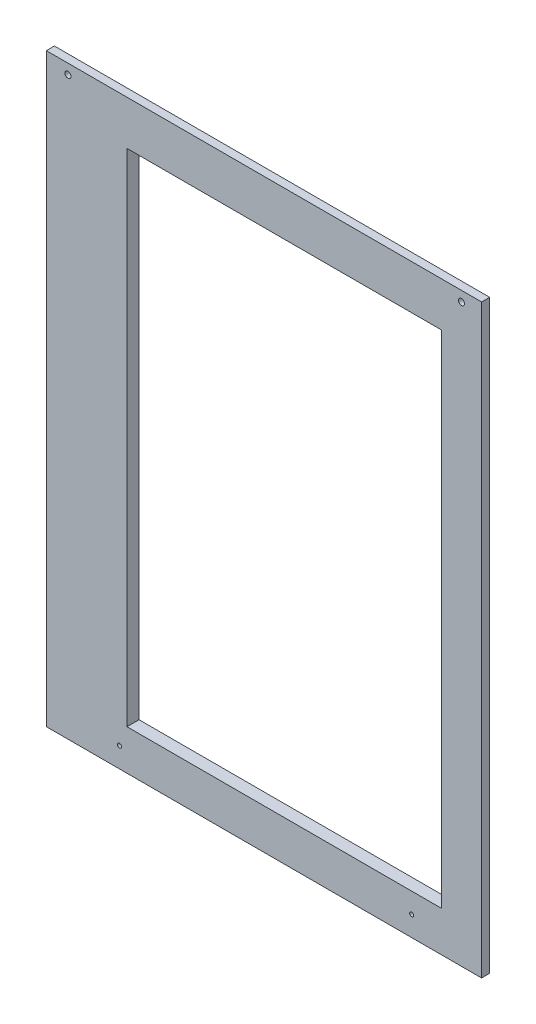
ISO-10303-21;
HEADER;
FILE_DESCRIPTION(('STEP AP214'),'2;1');
FILE_NAME('part.step','',(''),(''),'','','');
FILE_SCHEMA(('AUTOMOTIVE_DESIGN { 1 0 10303 214 1 1 1 1 }'));
ENDSEC;
DATA;
#1=APPLICATION_CONTEXT('core data for automotive mechanical design processes');
#2=APPLICATION_PROTOCOL_DEFINITION('international standard','automotive_design',2000,#1);
#3=PRODUCT_CONTEXT('',#1,'mechanical');
#4=PRODUCT('Part','Part','',(#3));
#5=PRODUCT_RELATED_PRODUCT_CATEGORY('part','',(#4));
#6=PRODUCT_DEFINITION_FORMATION('','',#4);
#7=PRODUCT_DEFINITION_CONTEXT('part definition',#1,'design');
#8=PRODUCT_DEFINITION('design','',#6,#7);
#9=PRODUCT_DEFINITION_SHAPE('','',#8);
#10=(LENGTH_UNIT() NAMED_UNIT(*) SI_UNIT(.MILLI.,.METRE.));
#11=(NAMED_UNIT(*) PLANE_ANGLE_UNIT() SI_UNIT($,.RADIAN.));
#12=(NAMED_UNIT(*) SI_UNIT($,.STERADIAN.) SOLID_ANGLE_UNIT());
#13=UNCERTAINTY_MEASURE_WITH_UNIT(LENGTH_MEASURE(1.E-05),#10,'distance_accuracy_value','');
#14=(GEOMETRIC_REPRESENTATION_CONTEXT(3) GLOBAL_UNCERTAINTY_ASSIGNED_CONTEXT((#13)) GLOBAL_UNIT_ASSIGNED_CONTEXT((#10,
#11,#12)) REPRESENTATION_CONTEXT('',''));
#15=CARTESIAN_POINT('',(0.,0.,0.));
#16=DIRECTION('',(0.,0.,1.));
#17=DIRECTION('',(1.,0.,0.));
#18=AXIS2_PLACEMENT_3D('',#15,#16,#17);
#19=CARTESIAN_POINT('',(18.3499099026795,694.896071586655,4.));
#20=DIRECTION('',(0.,-1.,0.));
#21=DIRECTION('',(1.,0.,0.));
#22=AXIS2_PLACEMENT_3D('',#19,#20,#21);
#23=PLANE('',#22);
#24=DIRECTION('',(-1.,0.,0.));
#25=VECTOR('',#24,1.);
#26=CARTESIAN_POINT('',(18.3499099026795,694.896071586655,4.));
#27=LINE('',#26,#25);
#28=CARTESIAN_POINT('',(217.11384192518,694.896071586655,4.));
#29=VERTEX_POINT('',#28);
#30=CARTESIAN_POINT('',(26.3034685740797,694.896071586655,4.));
#31=VERTEX_POINT('',#30);
#32=EDGE_CURVE('E218',#29,#31,#27,.T.);
#33=ORIENTED_EDGE('',*,*,#32,.F.);
#34=DIRECTION('',(0.,0.,-1.));
#35=VECTOR('',#34,1.);
#36=CARTESIAN_POINT('',(217.11384192518,694.896071586655,4.));
#37=LINE('',#36,#35);
#38=CARTESIAN_POINT('',(217.11384192518,694.896071586655,0.));
#39=VERTEX_POINT('',#38);
#40=EDGE_CURVE('E196',#29,#39,#37,.T.);
#41=ORIENTED_EDGE('',*,*,#40,.T.);
#42=DIRECTION('',(-1.,0.,0.));
#43=VECTOR('',#42,1.);
#44=CARTESIAN_POINT('',(18.3499099026795,694.896071586655,0.));
#45=LINE('',#44,#43);
#46=CARTESIAN_POINT('',(26.3034685740797,694.896071586655,0.));
#47=VERTEX_POINT('',#46);
#48=EDGE_CURVE('E57',#39,#47,#45,.T.);
#49=ORIENTED_EDGE('',*,*,#48,.T.);
#50=DIRECTION('',(0.,0.,-1.));
#51=VECTOR('',#50,1.);
#52=CARTESIAN_POINT('',(26.3034685740797,694.896071586655,4.));
#53=LINE('',#52,#51);
#54=EDGE_CURVE('E374',#47,#31,#53,.F.);
#55=ORIENTED_EDGE('',*,*,#54,.T.);
#56=EDGE_LOOP('',(#33,#41,#49,#55));
#57=FACE_BOUND('',#56,.T.);
#58=ADVANCED_FACE('F34',(#57),#23,.F.);
#59=CARTESIAN_POINT('',(21.83133261908,694.896071586655,4.));
#60=VERTEX_POINT('',#59);
#61=CARTESIAN_POINT('',(18.3499099026795,694.896071586655,4.));
#62=VERTEX_POINT('',#61);
#63=EDGE_CURVE('E220',#60,#62,#27,.T.);
#64=ORIENTED_EDGE('',*,*,#63,.F.);
#65=DIRECTION('',(0.,0.,-1.));
#66=VECTOR('',#65,1.);
#67=CARTESIAN_POINT('',(21.83133261908,694.896071586655,4.));
#68=LINE('',#67,#66);
#69=CARTESIAN_POINT('',(21.83133261908,694.896071586655,0.));
#70=VERTEX_POINT('',#69);
#71=EDGE_CURVE('E369',#60,#70,#68,.T.);
#72=ORIENTED_EDGE('',*,*,#71,.T.);
#73=CARTESIAN_POINT('',(18.3499099026795,694.896071586655,0.));
#74=VERTEX_POINT('',#73);
#75=EDGE_CURVE('E471',#70,#74,#45,.T.);
#76=ORIENTED_EDGE('',*,*,#75,.T.);
#77=DIRECTION('',(0.,0.,-1.));
#78=VECTOR('',#77,1.);
#79=CARTESIAN_POINT('',(18.3499099026795,694.896071586655,4.));
#80=LINE('',#79,#78);
#81=EDGE_CURVE('E217',#62,#74,#80,.T.);
#82=ORIENTED_EDGE('',*,*,#81,.F.);
#83=EDGE_LOOP('',(#64,#72,#76,#82));
#84=FACE_BOUND('',#83,.T.);
#85=ADVANCED_FACE('F447',(#84),#23,.F.);
#86=CARTESIAN_POINT('',(209.34990990268,679.896071586655,8.));
#87=DIRECTION('',(1.,0.,0.));
#88=DIRECTION('',(0.,1.,0.));
#89=AXIS2_PLACEMENT_3D('',#86,#87,#88);
#90=PLANE('',#89);
#91=DIRECTION('',(0.,1.,0.));
#92=VECTOR('',#91,1.);
#93=CARTESIAN_POINT('',(209.34990990268,679.896071586655,2.));
#94=LINE('',#93,#92);
#95=CARTESIAN_POINT('',(209.34990990268,431.342680996655,2.));
#96=VERTEX_POINT('',#95);
#97=CARTESIAN_POINT('',(209.34990990268,679.896071586655,2.));
#98=VERTEX_POINT('',#97);
#99=EDGE_CURVE('E290',#96,#98,#94,.T.);
#100=ORIENTED_EDGE('',*,*,#99,.F.);
#101=DIRECTION('',(0.,0.,-1.));
#102=VECTOR('',#101,1.);
#103=CARTESIAN_POINT('',(209.34990990268,431.342680996655,8.));
#104=LINE('',#103,#102);
#105=CARTESIAN_POINT('',(209.34990990268,431.342680996655,8.));
#106=VERTEX_POINT('',#105);
#107=EDGE_CURVE('E267',#106,#96,#104,.T.);
#108=ORIENTED_EDGE('',*,*,#107,.F.);
#109=DIRECTION('',(0.,-1.,0.));
#110=VECTOR('',#109,1.);
#111=CARTESIAN_POINT('',(209.34990990268,679.896071586655,8.));
#112=LINE('',#111,#110);
#113=CARTESIAN_POINT('',(209.34990990268,679.896071586655,8.));
#114=VERTEX_POINT('',#113);
#115=EDGE_CURVE('E287',#114,#106,#112,.T.);
#116=ORIENTED_EDGE('',*,*,#115,.F.);
#117=DIRECTION('',(0.,0.,-1.));
#118=VECTOR('',#117,1.);
#119=CARTESIAN_POINT('',(209.34990990268,679.896071586655,8.));
#120=LINE('',#119,#118);
#121=EDGE_CURVE('E259',#114,#98,#120,.T.);
#122=ORIENTED_EDGE('',*,*,#121,.T.);
#123=EDGE_LOOP('',(#100,#108,#116,#122));
#124=FACE_BOUND('',#123,.T.);
#125=ADVANCED_FACE('F452',(#124),#90,.F.);
#126=CARTESIAN_POINT('',(209.34990990268,679.896071586655,8.));
#127=DIRECTION('',(0.,1.,0.));
#128=DIRECTION('',(0.,0.,1.));
#129=AXIS2_PLACEMENT_3D('',#126,#127,#128);
#130=PLANE('',#129);
#131=DIRECTION('',(-1.,0.,0.));
#132=VECTOR('',#131,1.);
#133=CARTESIAN_POINT('',(209.34990990268,679.896071586655,2.));
#134=LINE('',#133,#132);
#135=CARTESIAN_POINT('',(53.3499099026795,679.896071586655,2.));
#136=VERTEX_POINT('',#135);
#137=EDGE_CURVE('E292',#98,#136,#134,.T.);
#138=ORIENTED_EDGE('',*,*,#137,.F.);
#139=ORIENTED_EDGE('',*,*,#121,.F.);
#140=DIRECTION('',(1.,0.,0.));
#141=VECTOR('',#140,1.);
#142=CARTESIAN_POINT('',(209.34990990268,679.896071586655,8.));
#143=LINE('',#142,#141);
#144=CARTESIAN_POINT('',(53.3499099026795,679.896071586655,8.));
#145=VERTEX_POINT('',#144);
#146=EDGE_CURVE('E271',#145,#114,#143,.T.);
#147=ORIENTED_EDGE('',*,*,#146,.F.);
#148=DIRECTION('',(0.,0.,-1.));
#149=VECTOR('',#148,1.);
#150=CARTESIAN_POINT('',(53.3499099026795,679.896071586655,8.));
#151=LINE('',#150,#149);
#152=EDGE_CURVE('E274',#145,#136,#151,.T.);
#153=ORIENTED_EDGE('',*,*,#152,.T.);
#154=EDGE_LOOP('',(#138,#139,#147,#153));
#155=FACE_BOUND('',#154,.T.);
#156=ADVANCED_FACE('F497',(#155),#130,.F.);
#157=CARTESIAN_POINT('',(53.3499099026795,679.896071586655,8.));
#158=DIRECTION('',(-1.,0.,0.));
#159=DIRECTION('',(0.,-1.,0.));
#160=AXIS2_PLACEMENT_3D('',#157,#158,#159);
#161=PLANE('',#160);
#162=DIRECTION('',(0.,-1.,0.));
#163=VECTOR('',#162,1.);
#164=CARTESIAN_POINT('',(53.3499099026795,679.896071586655,2.));
#165=LINE('',#164,#163);
#166=CARTESIAN_POINT('',(53.3499099026795,431.342680996655,2.));
#167=VERTEX_POINT('',#166);
#168=EDGE_CURVE('E294',#136,#167,#165,.T.);
#169=ORIENTED_EDGE('',*,*,#168,.F.);
#170=ORIENTED_EDGE('',*,*,#152,.F.);
#171=DIRECTION('',(0.,1.,0.));
#172=VECTOR('',#171,1.);
#173=CARTESIAN_POINT('',(53.3499099026795,679.896071586655,8.));
#174=LINE('',#173,#172);
#175=CARTESIAN_POINT('',(53.3499099026795,431.342680996655,8.));
#176=VERTEX_POINT('',#175);
#177=EDGE_CURVE('E281',#176,#145,#174,.T.);
#178=ORIENTED_EDGE('',*,*,#177,.F.);
#179=DIRECTION('',(0.,0.,-1.));
#180=VECTOR('',#179,1.);
#181=CARTESIAN_POINT('',(53.3499099026795,431.342680996655,8.));
#182=LINE('',#181,#180);
#183=EDGE_CURVE('E270',#176,#167,#182,.T.);
#184=ORIENTED_EDGE('',*,*,#183,.T.);
#185=EDGE_LOOP('',(#169,#170,#178,#184));
#186=FACE_BOUND('',#185,.T.);
#187=ADVANCED_FACE('F491',(#186),#161,.F.);
#188=CARTESIAN_POINT('',(209.34990990268,431.342680996655,8.));
#189=DIRECTION('',(0.,-1.,0.));
#190=DIRECTION('',(0.,0.,-1.));
#191=AXIS2_PLACEMENT_3D('',#188,#189,#190);
#192=PLANE('',#191);
#193=DIRECTION('',(1.,0.,0.));
#194=VECTOR('',#193,1.);
#195=CARTESIAN_POINT('',(209.34990990268,431.342680996655,2.));
#196=LINE('',#195,#194);
#197=EDGE_CURVE('E11',#167,#96,#196,.T.);
#198=ORIENTED_EDGE('',*,*,#197,.F.);
#199=ORIENTED_EDGE('',*,*,#183,.F.);
#200=DIRECTION('',(-1.,0.,0.));
#201=VECTOR('',#200,1.);
#202=CARTESIAN_POINT('',(209.34990990268,431.342680996655,8.));
#203=LINE('',#202,#201);
#204=EDGE_CURVE('E284',#106,#176,#203,.T.);
#205=ORIENTED_EDGE('',*,*,#204,.F.);
#206=ORIENTED_EDGE('',*,*,#107,.T.);
#207=EDGE_LOOP('',(#198,#199,#205,#206));
#208=FACE_BOUND('',#207,.T.);
#209=ADVANCED_FACE('F487',(#208),#192,.F.);
#210=CARTESIAN_POINT('',(18.3499099026795,694.896071586655,4.));
#211=DIRECTION('',(1.,0.,0.));
#212=DIRECTION('',(0.,1.,0.));
#213=AXIS2_PLACEMENT_3D('',#210,#211,#212);
#214=PLANE('',#213);
#215=DIRECTION('',(0.,-1.,0.));
#216=VECTOR('',#215,1.);
#217=CARTESIAN_POINT('',(18.3499099026795,694.896071586655,0.));
#218=LINE('',#217,#216);
#219=CARTESIAN_POINT('',(18.3499099026796,416.342680996655,0.));
#220=VERTEX_POINT('',#219);
#221=EDGE_CURVE('E238',#74,#220,#218,.T.);
#222=ORIENTED_EDGE('',*,*,#221,.T.);
#223=DIRECTION('',(0.,0.,-1.));
#224=VECTOR('',#223,1.);
#225=CARTESIAN_POINT('',(18.3499099026796,416.342680996655,4.));
#226=LINE('',#225,#224);
#227=CARTESIAN_POINT('',(18.3499099026796,416.342680996655,4.));
#228=VERTEX_POINT('',#227);
#229=EDGE_CURVE('E42',#228,#220,#226,.T.);
#230=ORIENTED_EDGE('',*,*,#229,.F.);
#231=DIRECTION('',(0.,-1.,0.));
#232=VECTOR('',#231,1.);
#233=CARTESIAN_POINT('',(18.3499099026795,694.896071586655,4.));
#234=LINE('',#233,#232);
#235=EDGE_CURVE('E231',#62,#228,#234,.T.);
#236=ORIENTED_EDGE('',*,*,#235,.F.);
#237=ORIENTED_EDGE('',*,*,#81,.T.);
#238=EDGE_LOOP('',(#222,#230,#236,#237));
#239=FACE_BOUND('',#238,.T.);
#240=ADVANCED_FACE('F36',(#239),#214,.F.);
#241=CARTESIAN_POINT('',(18.3499099026796,416.342680996655,4.));
#242=DIRECTION('',(0.,1.,0.));
#243=DIRECTION('',(0.,0.,1.));
#244=AXIS2_PLACEMENT_3D('',#241,#242,#243);
#245=PLANE('',#244);
#246=DIRECTION('',(1.,0.,0.));
#247=VECTOR('',#246,1.);
#248=CARTESIAN_POINT('',(18.3499099026796,416.342680996655,0.));
#249=LINE('',#248,#247);
#250=CARTESIAN_POINT('',(224.34990990268,416.342680996655,0.));
#251=VERTEX_POINT('',#250);
#252=EDGE_CURVE('E472',#220,#251,#249,.T.);
#253=ORIENTED_EDGE('',*,*,#252,.T.);
#254=DIRECTION('',(0.,0.,-1.));
#255=VECTOR('',#254,1.);
#256=CARTESIAN_POINT('',(224.34990990268,416.342680996655,4.));
#257=LINE('',#256,#255);
#258=CARTESIAN_POINT('',(224.34990990268,416.342680996655,4.));
#259=VERTEX_POINT('',#258);
#260=EDGE_CURVE('E469',#259,#251,#257,.T.);
#261=ORIENTED_EDGE('',*,*,#260,.F.);
#262=DIRECTION('',(1.,0.,0.));
#263=VECTOR('',#262,1.);
#264=CARTESIAN_POINT('',(18.3499099026796,416.342680996655,4.));
#265=LINE('',#264,#263);
#266=EDGE_CURVE('E230',#228,#259,#265,.T.);
#267=ORIENTED_EDGE('',*,*,#266,.F.);
#268=ORIENTED_EDGE('',*,*,#229,.T.);
#269=EDGE_LOOP('',(#253,#261,#267,#268));
#270=FACE_BOUND('',#269,.T.);
#271=ADVANCED_FACE('F460',(#270),#245,.F.);
#272=CARTESIAN_POINT('',(224.34990990268,694.896071586655,4.));
#273=DIRECTION('',(-1.,0.,0.));
#274=DIRECTION('',(0.,-1.,0.));
#275=AXIS2_PLACEMENT_3D('',#272,#273,#274);
#276=PLANE('',#275);
#277=DIRECTION('',(0.,1.,0.));
#278=VECTOR('',#277,1.);
#279=CARTESIAN_POINT('',(224.34990990268,694.896071586655,0.));
#280=LINE('',#279,#278);
#281=CARTESIAN_POINT('',(224.34990990268,694.896071586655,0.));
#282=VERTEX_POINT('',#281);
#283=EDGE_CURVE('E468',#251,#282,#280,.T.);
#284=ORIENTED_EDGE('',*,*,#283,.T.);
#285=DIRECTION('',(0.,0.,-1.));
#286=VECTOR('',#285,1.);
#287=CARTESIAN_POINT('',(224.34990990268,694.896071586655,4.));
#288=LINE('',#287,#286);
#289=CARTESIAN_POINT('',(224.34990990268,694.896071586655,4.));
#290=VERTEX_POINT('',#289);
#291=EDGE_CURVE('E222',#290,#282,#288,.T.);
#292=ORIENTED_EDGE('',*,*,#291,.F.);
#293=DIRECTION('',(0.,1.,0.));
#294=VECTOR('',#293,1.);
#295=CARTESIAN_POINT('',(224.34990990268,694.896071586655,4.));
#296=LINE('',#295,#294);
#297=EDGE_CURVE('E216',#259,#290,#296,.T.);
#298=ORIENTED_EDGE('',*,*,#297,.F.);
#299=ORIENTED_EDGE('',*,*,#260,.T.);
#300=EDGE_LOOP('',(#284,#292,#298,#299));
#301=FACE_BOUND('',#300,.T.);
#302=ADVANCED_FACE('F456',(#301),#276,.F.);
#303=CARTESIAN_POINT('',(221.585977880179,694.896071586655,0.));
#304=VERTEX_POINT('',#303);
#305=EDGE_CURVE('E210',#282,#304,#45,.T.);
#306=ORIENTED_EDGE('',*,*,#305,.T.);
#307=DIRECTION('',(0.,0.,-1.));
#308=VECTOR('',#307,1.);
#309=CARTESIAN_POINT('',(221.585977880179,694.896071586655,4.));
#310=LINE('',#309,#308);
#311=CARTESIAN_POINT('',(221.585977880179,694.896071586655,4.));
#312=VERTEX_POINT('',#311);
#313=EDGE_CURVE('E49',#304,#312,#310,.F.);
#314=ORIENTED_EDGE('',*,*,#313,.T.);
#315=EDGE_CURVE('E207',#290,#312,#27,.T.);
#316=ORIENTED_EDGE('',*,*,#315,.F.);
#317=ORIENTED_EDGE('',*,*,#291,.T.);
#318=EDGE_LOOP('',(#306,#314,#316,#317));
#319=FACE_BOUND('',#318,.T.);
#320=ADVANCED_FACE('F205',(#319),#23,.F.);
#321=CARTESIAN_POINT('',(0.,0.,0.));
#322=DIRECTION('',(0.,0.,1.));
#323=DIRECTION('',(1.,0.,0.));
#324=AXIS2_PLACEMENT_3D('',#321,#322,#323);
#325=PLANE('',#324);
#326=CARTESIAN_POINT('',(194.662982919324,421.342680996655,0.));
#327=DIRECTION('',(0.,0.,1.));
#328=DIRECTION('',(1.,0.,0.));
#329=AXIS2_PLACEMENT_3D('',#326,#327,#328);
#330=CIRCLE('',#329,0.999999999999998);
#331=CARTESIAN_POINT('',(195.662982919324,421.342680996655,0.));
#332=VERTEX_POINT('',#331);
#333=EDGE_CURVE('E386',#332,#332,#330,.T.);
#334=ORIENTED_EDGE('',*,*,#333,.T.);
#335=EDGE_LOOP('',(#334));
#336=FACE_BOUND('',#335,.T.);
#337=CARTESIAN_POINT('',(49.6629829193239,421.342680996655,0.));
#338=DIRECTION('',(0.,0.,1.));
#339=DIRECTION('',(1.,0.,0.));
#340=AXIS2_PLACEMENT_3D('',#337,#338,#339);
#341=CIRCLE('',#340,0.999999999999998);
#342=CARTESIAN_POINT('',(50.6629829193239,421.342680996655,0.));
#343=VERTEX_POINT('',#342);
#344=EDGE_CURVE('E381',#343,#343,#341,.T.);
#345=ORIENTED_EDGE('',*,*,#344,.T.);
#346=EDGE_LOOP('',(#345));
#347=FACE_BOUND('',#346,.T.);
#348=DIRECTION('',(-1.,0.,0.));
#349=VECTOR('',#348,1.);
#350=CARTESIAN_POINT('',(51.1166559200612,426.342680996655,0.));
#351=LINE('',#350,#349);
#352=CARTESIAN_POINT('',(212.22858955912,426.342680996655,0.));
#353=VERTEX_POINT('',#352);
#354=CARTESIAN_POINT('',(50.4712302462391,426.342680996655,0.));
#355=VERTEX_POINT('',#354);
#356=EDGE_CURVE('E335',#353,#355,#351,.T.);
#357=ORIENTED_EDGE('',*,*,#356,.F.);
#358=CARTESIAN_POINT('',(213.136014933157,427.537075902268,0.));
#359=DIRECTION('',(0.,0.,-1.));
#360=DIRECTION('',(-1.,0.,0.));
#361=AXIS2_PLACEMENT_3D('',#358,#359,#360);
#362=CIRCLE('',#361,1.5);
#363=CARTESIAN_POINT('',(214.34990990268,428.418245013715,0.));
#364=VERTEX_POINT('',#363);
#365=EDGE_CURVE('E314',#364,#353,#362,.T.);
#366=ORIENTED_EDGE('',*,*,#365,.F.);
#367=DIRECTION('',(0.,-1.,0.));
#368=VECTOR('',#367,1.);
#369=CARTESIAN_POINT('',(214.34990990268,682.774751243096,0.));
#370=LINE('',#369,#368);
#371=CARTESIAN_POINT('',(214.34990990268,682.774751243096,0.));
#372=VERTEX_POINT('',#371);
#373=EDGE_CURVE('E317',#372,#364,#370,.T.);
#374=ORIENTED_EDGE('',*,*,#373,.F.);
#375=CARTESIAN_POINT('',(213.2892497309,683.835411414875,0.));
#376=DIRECTION('',(0.,0.,-1.));
#377=DIRECTION('',(-1.,0.,0.));
#378=AXIS2_PLACEMENT_3D('',#375,#376,#377);
#379=CIRCLE('',#378,1.49999999999997);
#380=CARTESIAN_POINT('',(212.22858955912,684.896071586655,0.));
#381=VERTEX_POINT('',#380);
#382=EDGE_CURVE('E320',#381,#372,#379,.T.);
#383=ORIENTED_EDGE('',*,*,#382,.F.);
#384=DIRECTION('',(1.,0.,0.));
#385=VECTOR('',#384,1.);
#386=CARTESIAN_POINT('',(212.22858955912,684.896071586655,0.));
#387=LINE('',#386,#385);
#388=CARTESIAN_POINT('',(50.471230246239,684.896071586655,0.));
#389=VERTEX_POINT('',#388);
#390=EDGE_CURVE('E323',#389,#381,#387,.T.);
#391=ORIENTED_EDGE('',*,*,#390,.F.);
#392=CARTESIAN_POINT('',(49.4105700744593,683.835411414875,0.));
#393=DIRECTION('',(0.,0.,-1.));
#394=DIRECTION('',(-1.,0.,0.));
#395=AXIS2_PLACEMENT_3D('',#392,#393,#394);
#396=CIRCLE('',#395,1.5);
#397=CARTESIAN_POINT('',(48.3499099026795,682.774751243095,0.));
#398=VERTEX_POINT('',#397);
#399=EDGE_CURVE('E326',#398,#389,#396,.T.);
#400=ORIENTED_EDGE('',*,*,#399,.F.);
#401=DIRECTION('',(0.,1.,0.));
#402=VECTOR('',#401,1.);
#403=CARTESIAN_POINT('',(48.3499099026795,682.774751243095,0.));
#404=LINE('',#403,#402);
#405=CARTESIAN_POINT('',(48.3499099026795,428.418245013715,0.));
#406=VERTEX_POINT('',#405);
#407=EDGE_CURVE('E329',#406,#398,#404,.T.);
#408=ORIENTED_EDGE('',*,*,#407,.F.);
#409=CARTESIAN_POINT('',(49.5638048722022,427.537075902268,0.));
#410=DIRECTION('',(0.,0.,-1.));
#411=DIRECTION('',(-1.,0.,0.));
#412=AXIS2_PLACEMENT_3D('',#409,#410,#411);
#413=CIRCLE('',#412,1.49999999999999);
#414=EDGE_CURVE('E332',#355,#406,#413,.T.);
#415=ORIENTED_EDGE('',*,*,#414,.F.);
#416=EDGE_LOOP('',(#357,#366,#374,#383,#391,#400,#408,#415));
#417=FACE_BOUND('',#416,.T.);
#418=ORIENTED_EDGE('',*,*,#48,.F.);
#419=CARTESIAN_POINT('',(219.34990990268,696.896071586655,0.));
#420=DIRECTION('',(0.,0.,-1.));
#421=DIRECTION('',(-1.,0.,0.));
#422=AXIS2_PLACEMENT_3D('',#419,#420,#421);
#423=CIRCLE('',#422,2.99999999999999);
#424=EDGE_CURVE('E200',#304,#39,#423,.T.);
#425=ORIENTED_EDGE('',*,*,#424,.F.);
#426=ORIENTED_EDGE('',*,*,#305,.F.);
#427=ORIENTED_EDGE('',*,*,#283,.F.);
#428=ORIENTED_EDGE('',*,*,#252,.F.);
#429=ORIENTED_EDGE('',*,*,#221,.F.);
#430=ORIENTED_EDGE('',*,*,#75,.F.);
#431=CARTESIAN_POINT('',(24.0674005965799,696.896071586655,0.));
#432=DIRECTION('',(0.,0.,-1.));
#433=DIRECTION('',(-1.,0.,0.));
#434=AXIS2_PLACEMENT_3D('',#431,#432,#433);
#435=CIRCLE('',#434,3.);
#436=EDGE_CURVE('E377',#47,#70,#435,.T.);
#437=ORIENTED_EDGE('',*,*,#436,.F.);
#438=EDGE_LOOP('',(#418,#425,#426,#427,#428,#429,#430,#437));
#439=FACE_BOUND('',#438,.T.);
#440=ADVANCED_FACE('F395',(#336,#347,#417,#439),#325,.F.);
#441=CARTESIAN_POINT('',(0.,0.,4.));
#442=DIRECTION('',(0.,0.,1.));
#443=DIRECTION('',(1.,0.,0.));
#444=AXIS2_PLACEMENT_3D('',#441,#442,#443);
#445=PLANE('',#444);
#446=DIRECTION('',(0.,-1.,0.));
#447=VECTOR('',#446,1.);
#448=CARTESIAN_POINT('',(13.3499099026795,701.896071586655,4.));
#449=LINE('',#448,#447);
#450=CARTESIAN_POINT('',(13.3499099026795,701.896071586655,4.));
#451=VERTEX_POINT('',#450);
#452=CARTESIAN_POINT('',(13.3499099026796,411.342680996655,4.));
#453=VERTEX_POINT('',#452);
#454=EDGE_CURVE('E256',#451,#453,#449,.T.);
#455=ORIENTED_EDGE('',*,*,#454,.F.);
#456=DIRECTION('',(-1.,0.,0.));
#457=VECTOR('',#456,1.);
#458=CARTESIAN_POINT('',(13.3499099026795,701.896071586655,4.));
#459=LINE('',#458,#457);
#460=CARTESIAN_POINT('',(229.34990990268,701.896071586655,4.));
#461=VERTEX_POINT('',#460);
#462=EDGE_CURVE('E249',#461,#451,#459,.T.);
#463=ORIENTED_EDGE('',*,*,#462,.F.);
#464=DIRECTION('',(0.,1.,0.));
#465=VECTOR('',#464,1.);
#466=CARTESIAN_POINT('',(229.34990990268,701.896071586655,4.));
#467=LINE('',#466,#465);
#468=CARTESIAN_POINT('',(229.34990990268,411.342680996655,4.));
#469=VERTEX_POINT('',#468);
#470=EDGE_CURVE('E252',#469,#461,#467,.T.);
#471=ORIENTED_EDGE('',*,*,#470,.F.);
#472=DIRECTION('',(1.,0.,0.));
#473=VECTOR('',#472,1.);
#474=CARTESIAN_POINT('',(13.3499099026796,411.342680996655,4.));
#475=LINE('',#474,#473);
#476=EDGE_CURVE('E254',#453,#469,#475,.T.);
#477=ORIENTED_EDGE('',*,*,#476,.F.);
#478=EDGE_LOOP('',(#455,#463,#471,#477));
#479=FACE_BOUND('',#478,.T.);
#480=ORIENTED_EDGE('',*,*,#315,.T.);
#481=CARTESIAN_POINT('',(219.34990990268,696.896071586655,4.));
#482=DIRECTION('',(0.,0.,-1.));
#483=DIRECTION('',(-1.,0.,0.));
#484=AXIS2_PLACEMENT_3D('',#481,#482,#483);
#485=CIRCLE('',#484,2.99999999999999);
#486=EDGE_CURVE('E194',#312,#29,#485,.T.);
#487=ORIENTED_EDGE('',*,*,#486,.T.);
#488=ORIENTED_EDGE('',*,*,#32,.T.);
#489=CARTESIAN_POINT('',(24.0674005965799,696.896071586655,4.));
#490=DIRECTION('',(0.,0.,-1.));
#491=DIRECTION('',(-1.,0.,0.));
#492=AXIS2_PLACEMENT_3D('',#489,#490,#491);
#493=CIRCLE('',#492,3.);
#494=EDGE_CURVE('E376',#31,#60,#493,.T.);
#495=ORIENTED_EDGE('',*,*,#494,.T.);
#496=ORIENTED_EDGE('',*,*,#63,.T.);
#497=ORIENTED_EDGE('',*,*,#235,.T.);
#498=ORIENTED_EDGE('',*,*,#266,.T.);
#499=ORIENTED_EDGE('',*,*,#297,.T.);
#500=EDGE_LOOP('',(#480,#487,#488,#495,#496,#497,#498,#499));
#501=FACE_BOUND('',#500,.T.);
#502=CARTESIAN_POINT('',(24.0674005965799,696.896071586655,4.));
#503=DIRECTION('',(0.,0.,-1.));
#504=DIRECTION('',(1.,0.,0.));
#505=AXIS2_PLACEMENT_3D('',#502,#503,#504);
#506=CIRCLE('',#505,1.5);
#507=CARTESIAN_POINT('',(25.5674005965799,696.896071586655,4.));
#508=VERTEX_POINT('',#507);
#509=EDGE_CURVE('E366',#508,#508,#506,.T.);
#510=ORIENTED_EDGE('',*,*,#509,.F.);
#511=EDGE_LOOP('',(#510));
#512=FACE_BOUND('',#511,.T.);
#513=CARTESIAN_POINT('',(219.34990990268,696.896071586655,4.));
#514=DIRECTION('',(0.,0.,-1.));
#515=DIRECTION('',(-1.,0.,0.));
#516=AXIS2_PLACEMENT_3D('',#513,#514,#515);
#517=CIRCLE('',#516,1.5);
#518=CARTESIAN_POINT('',(217.84990990268,696.896071586655,4.));
#519=VERTEX_POINT('',#518);
#520=EDGE_CURVE('E360',#519,#519,#517,.T.);
#521=ORIENTED_EDGE('',*,*,#520,.F.);
#522=EDGE_LOOP('',(#521));
#523=FACE_BOUND('',#522,.T.);
#524=ADVANCED_FACE('F212',(#479,#501,#512,#523),#445,.F.);
#525=CARTESIAN_POINT('',(13.3499099026795,701.896071586655,8.));
#526=DIRECTION('',(1.,0.,0.));
#527=DIRECTION('',(0.,1.,0.));
#528=AXIS2_PLACEMENT_3D('',#525,#526,#527);
#529=PLANE('',#528);
#530=ORIENTED_EDGE('',*,*,#454,.T.);
#531=DIRECTION('',(0.,0.,-1.));
#532=VECTOR('',#531,1.);
#533=CARTESIAN_POINT('',(13.3499099026796,411.342680996655,8.));
#534=LINE('',#533,#532);
#535=CARTESIAN_POINT('',(13.3499099026796,411.342680996655,8.));
#536=VERTEX_POINT('',#535);
#537=EDGE_CURVE('E235',#536,#453,#534,.T.);
#538=ORIENTED_EDGE('',*,*,#537,.F.);
#539=DIRECTION('',(0.,-1.,0.));
#540=VECTOR('',#539,1.);
#541=CARTESIAN_POINT('',(13.3499099026795,701.896071586655,8.));
#542=LINE('',#541,#540);
#543=CARTESIAN_POINT('',(13.3499099026795,701.896071586655,8.));
#544=VERTEX_POINT('',#543);
#545=EDGE_CURVE('E251',#544,#536,#542,.T.);
#546=ORIENTED_EDGE('',*,*,#545,.F.);
#547=DIRECTION('',(0.,0.,-1.));
#548=VECTOR('',#547,1.);
#549=CARTESIAN_POINT('',(13.3499099026795,701.896071586655,8.));
#550=LINE('',#549,#548);
#551=EDGE_CURVE('E245',#544,#451,#550,.T.);
#552=ORIENTED_EDGE('',*,*,#551,.T.);
#553=EDGE_LOOP('',(#530,#538,#546,#552));
#554=FACE_BOUND('',#553,.T.);
#555=ADVANCED_FACE('F425',(#554),#529,.F.);
#556=CARTESIAN_POINT('',(13.3499099026796,411.342680996655,8.));
#557=DIRECTION('',(0.,1.,0.));
#558=DIRECTION('',(0.,0.,1.));
#559=AXIS2_PLACEMENT_3D('',#556,#557,#558);
#560=PLANE('',#559);
#561=ORIENTED_EDGE('',*,*,#476,.T.);
#562=DIRECTION('',(0.,0.,-1.));
#563=VECTOR('',#562,1.);
#564=CARTESIAN_POINT('',(229.34990990268,411.342680996655,8.));
#565=LINE('',#564,#563);
#566=CARTESIAN_POINT('',(229.34990990268,411.342680996655,8.));
#567=VERTEX_POINT('',#566);
#568=EDGE_CURVE('E239',#567,#469,#565,.T.);
#569=ORIENTED_EDGE('',*,*,#568,.F.);
#570=DIRECTION('',(1.,0.,0.));
#571=VECTOR('',#570,1.);
#572=CARTESIAN_POINT('',(13.3499099026796,411.342680996655,8.));
#573=LINE('',#572,#571);
#574=EDGE_CURVE('E263',#536,#567,#573,.T.);
#575=ORIENTED_EDGE('',*,*,#574,.F.);
#576=ORIENTED_EDGE('',*,*,#537,.T.);
#577=EDGE_LOOP('',(#561,#569,#575,#576));
#578=FACE_BOUND('',#577,.T.);
#579=ADVANCED_FACE('F428',(#578),#560,.F.);
#580=CARTESIAN_POINT('',(229.34990990268,701.896071586655,8.));
#581=DIRECTION('',(-1.,0.,0.));
#582=DIRECTION('',(0.,-1.,0.));
#583=AXIS2_PLACEMENT_3D('',#580,#581,#582);
#584=PLANE('',#583);
#585=ORIENTED_EDGE('',*,*,#470,.T.);
#586=DIRECTION('',(0.,0.,-1.));
#587=VECTOR('',#586,1.);
#588=CARTESIAN_POINT('',(229.34990990268,701.896071586655,8.));
#589=LINE('',#588,#587);
#590=CARTESIAN_POINT('',(229.34990990268,701.896071586655,8.));
#591=VERTEX_POINT('',#590);
#592=EDGE_CURVE('E242',#591,#461,#589,.T.);
#593=ORIENTED_EDGE('',*,*,#592,.F.);
#594=DIRECTION('',(0.,1.,0.));
#595=VECTOR('',#594,1.);
#596=CARTESIAN_POINT('',(229.34990990268,701.896071586655,8.));
#597=LINE('',#596,#595);
#598=EDGE_CURVE('E261',#567,#591,#597,.T.);
#599=ORIENTED_EDGE('',*,*,#598,.F.);
#600=ORIENTED_EDGE('',*,*,#568,.T.);
#601=EDGE_LOOP('',(#585,#593,#599,#600));
#602=FACE_BOUND('',#601,.T.);
#603=ADVANCED_FACE('F433',(#602),#584,.F.);
#604=CARTESIAN_POINT('',(13.3499099026795,701.896071586655,8.));
#605=DIRECTION('',(0.,-1.,0.));
#606=DIRECTION('',(0.,0.,-1.));
#607=AXIS2_PLACEMENT_3D('',#604,#605,#606);
#608=PLANE('',#607);
#609=ORIENTED_EDGE('',*,*,#462,.T.);
#610=ORIENTED_EDGE('',*,*,#551,.F.);
#611=DIRECTION('',(-1.,0.,0.));
#612=VECTOR('',#611,1.);
#613=CARTESIAN_POINT('',(13.3499099026795,701.896071586655,8.));
#614=LINE('',#613,#612);
#615=EDGE_CURVE('E248',#591,#544,#614,.T.);
#616=ORIENTED_EDGE('',*,*,#615,.F.);
#617=ORIENTED_EDGE('',*,*,#592,.T.);
#618=EDGE_LOOP('',(#609,#610,#616,#617));
#619=FACE_BOUND('',#618,.T.);
#620=ADVANCED_FACE('F409',(#619),#608,.F.);
#621=CARTESIAN_POINT('',(0.,0.,8.));
#622=DIRECTION('',(0.,0.,1.));
#623=DIRECTION('',(1.,0.,0.));
#624=AXIS2_PLACEMENT_3D('',#621,#622,#623);
#625=PLANE('',#624);
#626=CARTESIAN_POINT('',(194.662982919324,421.342680996655,8.));
#627=DIRECTION('',(0.,0.,1.));
#628=DIRECTION('',(1.,0.,0.));
#629=AXIS2_PLACEMENT_3D('',#626,#627,#628);
#630=CIRCLE('',#629,0.999999999999998);
#631=CARTESIAN_POINT('',(195.662982919324,421.342680996655,8.));
#632=VERTEX_POINT('',#631);
#633=EDGE_CURVE('E389',#632,#632,#630,.T.);
#634=ORIENTED_EDGE('',*,*,#633,.F.);
#635=EDGE_LOOP('',(#634));
#636=FACE_BOUND('',#635,.T.);
#637=CARTESIAN_POINT('',(49.6629829193239,421.342680996655,8.));
#638=DIRECTION('',(0.,0.,1.));
#639=DIRECTION('',(1.,0.,0.));
#640=AXIS2_PLACEMENT_3D('',#637,#638,#639);
#641=CIRCLE('',#640,0.999999999999998);
#642=CARTESIAN_POINT('',(50.6629829193239,421.342680996655,8.));
#643=VERTEX_POINT('',#642);
#644=EDGE_CURVE('E383',#643,#643,#641,.T.);
#645=ORIENTED_EDGE('',*,*,#644,.F.);
#646=EDGE_LOOP('',(#645));
#647=FACE_BOUND('',#646,.T.);
#648=CARTESIAN_POINT('',(24.0674005965799,696.896071586655,8.));
#649=DIRECTION('',(0.,0.,-1.));
#650=DIRECTION('',(1.,0.,0.));
#651=AXIS2_PLACEMENT_3D('',#648,#649,#650);
#652=CIRCLE('',#651,1.5);
#653=CARTESIAN_POINT('',(25.5674005965799,696.896071586655,8.));
#654=VERTEX_POINT('',#653);
#655=EDGE_CURVE('E363',#654,#654,#652,.T.);
#656=ORIENTED_EDGE('',*,*,#655,.T.);
#657=EDGE_LOOP('',(#656));
#658=FACE_BOUND('',#657,.T.);
#659=CARTESIAN_POINT('',(219.34990990268,696.896071586655,8.));
#660=DIRECTION('',(0.,0.,-1.));
#661=DIRECTION('',(-1.,0.,0.));
#662=AXIS2_PLACEMENT_3D('',#659,#660,#661);
#663=CIRCLE('',#662,1.5);
#664=CARTESIAN_POINT('',(217.84990990268,696.896071586655,8.));
#665=VERTEX_POINT('',#664);
#666=EDGE_CURVE('E338',#665,#665,#663,.T.);
#667=ORIENTED_EDGE('',*,*,#666,.T.);
#668=EDGE_LOOP('',(#667));
#669=FACE_BOUND('',#668,.T.);
#670=ORIENTED_EDGE('',*,*,#115,.T.);
#671=ORIENTED_EDGE('',*,*,#204,.T.);
#672=ORIENTED_EDGE('',*,*,#177,.T.);
#673=ORIENTED_EDGE('',*,*,#146,.T.);
#674=EDGE_LOOP('',(#670,#671,#672,#673));
#675=FACE_BOUND('',#674,.T.);
#676=ORIENTED_EDGE('',*,*,#545,.T.);
#677=ORIENTED_EDGE('',*,*,#574,.T.);
#678=ORIENTED_EDGE('',*,*,#598,.T.);
#679=ORIENTED_EDGE('',*,*,#615,.T.);
#680=EDGE_LOOP('',(#676,#677,#678,#679));
#681=FACE_BOUND('',#680,.T.);
#682=ADVANCED_FACE('F405',(#636,#647,#658,#669,#675,#681),#625,.T.);
#683=CARTESIAN_POINT('',(213.136014933157,427.537075902268,2.));
#684=DIRECTION('',(0.,0.,-1.));
#685=DIRECTION('',(-1.,0.,0.));
#686=AXIS2_PLACEMENT_3D('',#683,#684,#685);
#687=PLANE('',#686);
#688=DIRECTION('',(-1.,0.,0.));
#689=VECTOR('',#688,1.);
#690=CARTESIAN_POINT('',(211.583163885298,426.342680996655,2.));
#691=LINE('',#690,#689);
#692=CARTESIAN_POINT('',(212.22858955912,426.342680996655,2.));
#693=VERTEX_POINT('',#692);
#694=CARTESIAN_POINT('',(50.4712302462391,426.342680996655,2.));
#695=VERTEX_POINT('',#694);
#696=EDGE_CURVE('E316',#693,#695,#691,.T.);
#697=ORIENTED_EDGE('',*,*,#696,.T.);
#698=CARTESIAN_POINT('',(49.5638048722022,427.537075902268,2.));
#699=DIRECTION('',(0.,0.,-1.));
#700=DIRECTION('',(-1.,0.,0.));
#701=AXIS2_PLACEMENT_3D('',#698,#699,#700);
#702=CIRCLE('',#701,1.49999999999999);
#703=CARTESIAN_POINT('',(48.3499099026795,428.418245013715,2.));
#704=VERTEX_POINT('',#703);
#705=EDGE_CURVE('E356',#695,#704,#702,.T.);
#706=ORIENTED_EDGE('',*,*,#705,.T.);
#707=DIRECTION('',(0.,1.,0.));
#708=VECTOR('',#707,1.);
#709=CARTESIAN_POINT('',(48.3499099026795,682.774751243095,2.));
#710=LINE('',#709,#708);
#711=CARTESIAN_POINT('',(48.3499099026795,682.774751243095,2.));
#712=VERTEX_POINT('',#711);
#713=EDGE_CURVE('E353',#704,#712,#710,.T.);
#714=ORIENTED_EDGE('',*,*,#713,.T.);
#715=CARTESIAN_POINT('',(49.4105700744593,683.835411414875,2.));
#716=DIRECTION('',(0.,0.,-1.));
#717=DIRECTION('',(-1.,0.,0.));
#718=AXIS2_PLACEMENT_3D('',#715,#716,#717);
#719=CIRCLE('',#718,1.5);
#720=CARTESIAN_POINT('',(50.471230246239,684.896071586655,2.));
#721=VERTEX_POINT('',#720);
#722=EDGE_CURVE('E350',#712,#721,#719,.T.);
#723=ORIENTED_EDGE('',*,*,#722,.T.);
#724=DIRECTION('',(1.,0.,0.));
#725=VECTOR('',#724,1.);
#726=CARTESIAN_POINT('',(212.22858955912,684.896071586655,2.));
#727=LINE('',#726,#725);
#728=CARTESIAN_POINT('',(212.22858955912,684.896071586655,2.));
#729=VERTEX_POINT('',#728);
#730=EDGE_CURVE('E347',#721,#729,#727,.T.);
#731=ORIENTED_EDGE('',*,*,#730,.T.);
#732=CARTESIAN_POINT('',(213.2892497309,683.835411414875,2.));
#733=DIRECTION('',(0.,0.,-1.));
#734=DIRECTION('',(-1.,0.,0.));
#735=AXIS2_PLACEMENT_3D('',#732,#733,#734);
#736=CIRCLE('',#735,1.49999999999997);
#737=CARTESIAN_POINT('',(214.34990990268,682.774751243096,2.));
#738=VERTEX_POINT('',#737);
#739=EDGE_CURVE('E344',#729,#738,#736,.T.);
#740=ORIENTED_EDGE('',*,*,#739,.T.);
#741=DIRECTION('',(0.,-1.,0.));
#742=VECTOR('',#741,1.);
#743=CARTESIAN_POINT('',(214.34990990268,682.774751243096,2.));
#744=LINE('',#743,#742);
#745=CARTESIAN_POINT('',(214.34990990268,428.418245013715,2.));
#746=VERTEX_POINT('',#745);
#747=EDGE_CURVE('E341',#738,#746,#744,.T.);
#748=ORIENTED_EDGE('',*,*,#747,.T.);
#749=CARTESIAN_POINT('',(213.136014933157,427.537075902268,2.));
#750=DIRECTION('',(0.,0.,-1.));
#751=DIRECTION('',(-1.,0.,0.));
#752=AXIS2_PLACEMENT_3D('',#749,#750,#751);
#753=CIRCLE('',#752,1.5);
#754=EDGE_CURVE('E300',#746,#693,#753,.T.);
#755=ORIENTED_EDGE('',*,*,#754,.T.);
#756=EDGE_LOOP('',(#697,#706,#714,#723,#731,#740,#748,#755));
#757=FACE_BOUND('',#756,.T.);
#758=ORIENTED_EDGE('',*,*,#99,.T.);
#759=ORIENTED_EDGE('',*,*,#137,.T.);
#760=ORIENTED_EDGE('',*,*,#168,.T.);
#761=ORIENTED_EDGE('',*,*,#197,.T.);
#762=EDGE_LOOP('',(#758,#759,#760,#761));
#763=FACE_BOUND('',#762,.T.);
#764=ADVANCED_FACE('F408',(#757,#763),#687,.T.);
#765=CARTESIAN_POINT('',(213.136014933157,427.537075902268,2.));
#766=DIRECTION('',(0.,0.,-1.));
#767=DIRECTION('',(-1.,0.,0.));
#768=AXIS2_PLACEMENT_3D('',#765,#766,#767);
#769=CYLINDRICAL_SURFACE('',#768,1.5);
#770=ORIENTED_EDGE('',*,*,#365,.T.);
#771=DIRECTION('',(0.,0.,-1.));
#772=VECTOR('',#771,1.);
#773=CARTESIAN_POINT('',(212.22858955912,426.342680996655,2.));
#774=LINE('',#773,#772);
#775=EDGE_CURVE('E296',#693,#353,#774,.T.);
#776=ORIENTED_EDGE('',*,*,#775,.F.);
#777=ORIENTED_EDGE('',*,*,#754,.F.);
#778=DIRECTION('',(0.,0.,-1.));
#779=VECTOR('',#778,1.);
#780=CARTESIAN_POINT('',(214.34990990268,428.418245013715,2.));
#781=LINE('',#780,#779);
#782=EDGE_CURVE('E310',#746,#364,#781,.T.);
#783=ORIENTED_EDGE('',*,*,#782,.T.);
#784=EDGE_LOOP('',(#770,#776,#777,#783));
#785=FACE_BOUND('',#784,.T.);
#786=ADVANCED_FACE('F517',(#785),#769,.F.);
#787=CARTESIAN_POINT('',(214.34990990268,682.774751243096,2.));
#788=DIRECTION('',(1.,0.,0.));
#789=DIRECTION('',(0.,0.,-1.));
#790=AXIS2_PLACEMENT_3D('',#787,#788,#789);
#791=PLANE('',#790);
#792=ORIENTED_EDGE('',*,*,#373,.T.);
#793=ORIENTED_EDGE('',*,*,#782,.F.);
#794=ORIENTED_EDGE('',*,*,#747,.F.);
#795=DIRECTION('',(0.,0.,-1.));
#796=VECTOR('',#795,1.);
#797=CARTESIAN_POINT('',(214.34990990268,682.774751243096,2.));
#798=LINE('',#797,#796);
#799=EDGE_CURVE('E308',#738,#372,#798,.T.);
#800=ORIENTED_EDGE('',*,*,#799,.T.);
#801=EDGE_LOOP('',(#792,#793,#794,#800));
#802=FACE_BOUND('',#801,.T.);
#803=ADVANCED_FACE('F523',(#802),#791,.F.);
#804=CARTESIAN_POINT('',(213.2892497309,683.835411414875,2.));
#805=DIRECTION('',(0.,0.,-1.));
#806=DIRECTION('',(-1.,0.,0.));
#807=AXIS2_PLACEMENT_3D('',#804,#805,#806);
#808=CYLINDRICAL_SURFACE('',#807,1.49999999999997);
#809=ORIENTED_EDGE('',*,*,#382,.T.);
#810=ORIENTED_EDGE('',*,*,#799,.F.);
#811=ORIENTED_EDGE('',*,*,#739,.F.);
#812=DIRECTION('',(0.,0.,-1.));
#813=VECTOR('',#812,1.);
#814=CARTESIAN_POINT('',(212.22858955912,684.896071586655,2.));
#815=LINE('',#814,#813);
#816=EDGE_CURVE('E306',#729,#381,#815,.T.);
#817=ORIENTED_EDGE('',*,*,#816,.T.);
#818=EDGE_LOOP('',(#809,#810,#811,#817));
#819=FACE_BOUND('',#818,.T.);
#820=ADVANCED_FACE('F532',(#819),#808,.F.);
#821=CARTESIAN_POINT('',(212.22858955912,684.896071586655,2.));
#822=DIRECTION('',(0.,1.,0.));
#823=DIRECTION('',(0.,0.,1.));
#824=AXIS2_PLACEMENT_3D('',#821,#822,#823);
#825=PLANE('',#824);
#826=ORIENTED_EDGE('',*,*,#390,.T.);
#827=ORIENTED_EDGE('',*,*,#816,.F.);
#828=ORIENTED_EDGE('',*,*,#730,.F.);
#829=DIRECTION('',(0.,0.,-1.));
#830=VECTOR('',#829,1.);
#831=CARTESIAN_POINT('',(50.471230246239,684.896071586655,2.));
#832=LINE('',#831,#830);
#833=EDGE_CURVE('E304',#721,#389,#832,.T.);
#834=ORIENTED_EDGE('',*,*,#833,.T.);
#835=EDGE_LOOP('',(#826,#827,#828,#834));
#836=FACE_BOUND('',#835,.T.);
#837=ADVANCED_FACE('F536',(#836),#825,.F.);
#838=CARTESIAN_POINT('',(49.4105700744593,683.835411414875,2.));
#839=DIRECTION('',(0.,0.,-1.));
#840=DIRECTION('',(-1.,0.,0.));
#841=AXIS2_PLACEMENT_3D('',#838,#839,#840);
#842=CYLINDRICAL_SURFACE('',#841,1.5);
#843=ORIENTED_EDGE('',*,*,#399,.T.);
#844=ORIENTED_EDGE('',*,*,#833,.F.);
#845=ORIENTED_EDGE('',*,*,#722,.F.);
#846=DIRECTION('',(0.,0.,-1.));
#847=VECTOR('',#846,1.);
#848=CARTESIAN_POINT('',(48.3499099026795,682.774751243095,2.));
#849=LINE('',#848,#847);
#850=EDGE_CURVE('E302',#712,#398,#849,.T.);
#851=ORIENTED_EDGE('',*,*,#850,.T.);
#852=EDGE_LOOP('',(#843,#844,#845,#851));
#853=FACE_BOUND('',#852,.T.);
#854=ADVANCED_FACE('F540',(#853),#842,.F.);
#855=CARTESIAN_POINT('',(48.3499099026795,682.774751243095,2.));
#856=DIRECTION('',(-1.,0.,0.));
#857=DIRECTION('',(0.,-1.,0.));
#858=AXIS2_PLACEMENT_3D('',#855,#856,#857);
#859=PLANE('',#858);
#860=ORIENTED_EDGE('',*,*,#407,.T.);
#861=ORIENTED_EDGE('',*,*,#850,.F.);
#862=ORIENTED_EDGE('',*,*,#713,.F.);
#863=DIRECTION('',(0.,0.,-1.));
#864=VECTOR('',#863,1.);
#865=CARTESIAN_POINT('',(48.3499099026795,428.418245013715,2.));
#866=LINE('',#865,#864);
#867=EDGE_CURVE('E299',#704,#406,#866,.T.);
#868=ORIENTED_EDGE('',*,*,#867,.T.);
#869=EDGE_LOOP('',(#860,#861,#862,#868));
#870=FACE_BOUND('',#869,.T.);
#871=ADVANCED_FACE('F544',(#870),#859,.F.);
#872=CARTESIAN_POINT('',(49.5638048722022,427.537075902268,2.));
#873=DIRECTION('',(0.,0.,-1.));
#874=DIRECTION('',(-1.,0.,0.));
#875=AXIS2_PLACEMENT_3D('',#872,#873,#874);
#876=CYLINDRICAL_SURFACE('',#875,1.49999999999999);
#877=ORIENTED_EDGE('',*,*,#414,.T.);
#878=ORIENTED_EDGE('',*,*,#867,.F.);
#879=ORIENTED_EDGE('',*,*,#705,.F.);
#880=DIRECTION('',(0.,0.,-1.));
#881=VECTOR('',#880,1.);
#882=CARTESIAN_POINT('',(50.4712302462391,426.342680996655,2.));
#883=LINE('',#882,#881);
#884=EDGE_CURVE('E297',#695,#355,#883,.T.);
#885=ORIENTED_EDGE('',*,*,#884,.T.);
#886=EDGE_LOOP('',(#877,#878,#879,#885));
#887=FACE_BOUND('',#886,.T.);
#888=ADVANCED_FACE('F548',(#887),#876,.F.);
#889=CARTESIAN_POINT('',(51.1166559200612,426.342680996655,2.));
#890=DIRECTION('',(0.,-1.,0.));
#891=DIRECTION('',(0.,0.,-1.));
#892=AXIS2_PLACEMENT_3D('',#889,#890,#891);
#893=PLANE('',#892);
#894=ORIENTED_EDGE('',*,*,#356,.T.);
#895=ORIENTED_EDGE('',*,*,#884,.F.);
#896=ORIENTED_EDGE('',*,*,#696,.F.);
#897=ORIENTED_EDGE('',*,*,#775,.T.);
#898=EDGE_LOOP('',(#894,#895,#896,#897));
#899=FACE_BOUND('',#898,.T.);
#900=ADVANCED_FACE('F552',(#899),#893,.F.);
#901=CARTESIAN_POINT('',(219.34990990268,696.896071586655,8.));
#902=DIRECTION('',(0.,0.,-1.));
#903=DIRECTION('',(-1.,0.,0.));
#904=AXIS2_PLACEMENT_3D('',#901,#902,#903);
#905=CYLINDRICAL_SURFACE('',#904,1.5);
#906=ORIENTED_EDGE('',*,*,#666,.F.);
#907=EDGE_LOOP('',(#906));
#908=FACE_BOUND('',#907,.T.);
#909=ORIENTED_EDGE('',*,*,#520,.T.);
#910=EDGE_LOOP('',(#909));
#911=FACE_BOUND('',#910,.T.);
#912=ADVANCED_FACE('F527',(#908,#911),#905,.F.);
#913=CARTESIAN_POINT('',(24.0674005965799,696.896071586655,8.));
#914=DIRECTION('',(0.,0.,-1.));
#915=DIRECTION('',(-1.,0.,0.));
#916=AXIS2_PLACEMENT_3D('',#913,#914,#915);
#917=CYLINDRICAL_SURFACE('',#916,1.5);
#918=ORIENTED_EDGE('',*,*,#655,.F.);
#919=EDGE_LOOP('',(#918));
#920=FACE_BOUND('',#919,.T.);
#921=ORIENTED_EDGE('',*,*,#509,.T.);
#922=EDGE_LOOP('',(#921));
#923=FACE_BOUND('',#922,.T.);
#924=ADVANCED_FACE('F559',(#920,#923),#917,.F.);
#925=CARTESIAN_POINT('',(24.0674005965799,696.896071586655,4.));
#926=DIRECTION('',(0.,0.,-1.));
#927=DIRECTION('',(-1.,0.,0.));
#928=AXIS2_PLACEMENT_3D('',#925,#926,#927);
#929=CYLINDRICAL_SURFACE('',#928,3.);
#930=ORIENTED_EDGE('',*,*,#494,.F.);
#931=ORIENTED_EDGE('',*,*,#54,.F.);
#932=ORIENTED_EDGE('',*,*,#436,.T.);
#933=ORIENTED_EDGE('',*,*,#71,.F.);
#934=EDGE_LOOP('',(#930,#931,#932,#933));
#935=FACE_BOUND('',#934,.T.);
#936=ADVANCED_FACE('F582',(#935),#929,.F.);
#937=CARTESIAN_POINT('',(219.34990990268,696.896071586655,4.));
#938=DIRECTION('',(0.,0.,-1.));
#939=DIRECTION('',(-1.,0.,0.));
#940=AXIS2_PLACEMENT_3D('',#937,#938,#939);
#941=CYLINDRICAL_SURFACE('',#940,2.99999999999999);
#942=ORIENTED_EDGE('',*,*,#486,.F.);
#943=ORIENTED_EDGE('',*,*,#313,.F.);
#944=ORIENTED_EDGE('',*,*,#424,.T.);
#945=ORIENTED_EDGE('',*,*,#40,.F.);
#946=EDGE_LOOP('',(#942,#943,#944,#945));
#947=FACE_BOUND('',#946,.T.);
#948=ADVANCED_FACE('F195',(#947),#941,.F.);
#949=CARTESIAN_POINT('',(49.6629829193239,421.342680996655,0.));
#950=DIRECTION('',(0.,0.,1.));
#951=DIRECTION('',(1.,0.,0.));
#952=AXIS2_PLACEMENT_3D('',#949,#950,#951);
#953=CYLINDRICAL_SURFACE('',#952,0.999999999999998);
#954=ORIENTED_EDGE('',*,*,#344,.F.);
#955=EDGE_LOOP('',(#954));
#956=FACE_BOUND('',#955,.T.);
#957=ORIENTED_EDGE('',*,*,#644,.T.);
#958=EDGE_LOOP('',(#957));
#959=FACE_BOUND('',#958,.T.);
#960=ADVANCED_FACE('F401',(#956,#959),#953,.F.);
#961=CARTESIAN_POINT('',(194.662982919324,421.342680996655,0.));
#962=DIRECTION('',(0.,0.,1.));
#963=DIRECTION('',(1.,0.,0.));
#964=AXIS2_PLACEMENT_3D('',#961,#962,#963);
#965=CYLINDRICAL_SURFACE('',#964,0.999999999999998);
#966=ORIENTED_EDGE('',*,*,#333,.F.);
#967=EDGE_LOOP('',(#966));
#968=FACE_BOUND('',#967,.T.);
#969=ORIENTED_EDGE('',*,*,#633,.T.);
#970=EDGE_LOOP('',(#969));
#971=FACE_BOUND('',#970,.T.);
#972=ADVANCED_FACE('F398',(#968,#971),#965,.F.);
#973=CLOSED_SHELL('',(#58,#85,#125,#156,#187,#209,#240,#271,#302,#320,#440,#524,#555,#579,#603,
#620,#682,#764,#786,#803,#820,#837,#854,#871,#888,#900,#912,#924,#936,#948,#960,#972));
#974=MANIFOLD_SOLID_BREP('B2',#973);
#975=ADVANCED_BREP_SHAPE_REPRESENTATION('',(#18,#974),#14);
#976=SHAPE_DEFINITION_REPRESENTATION(#9,#975);
ENDSEC;
END-ISO-10303-21;
